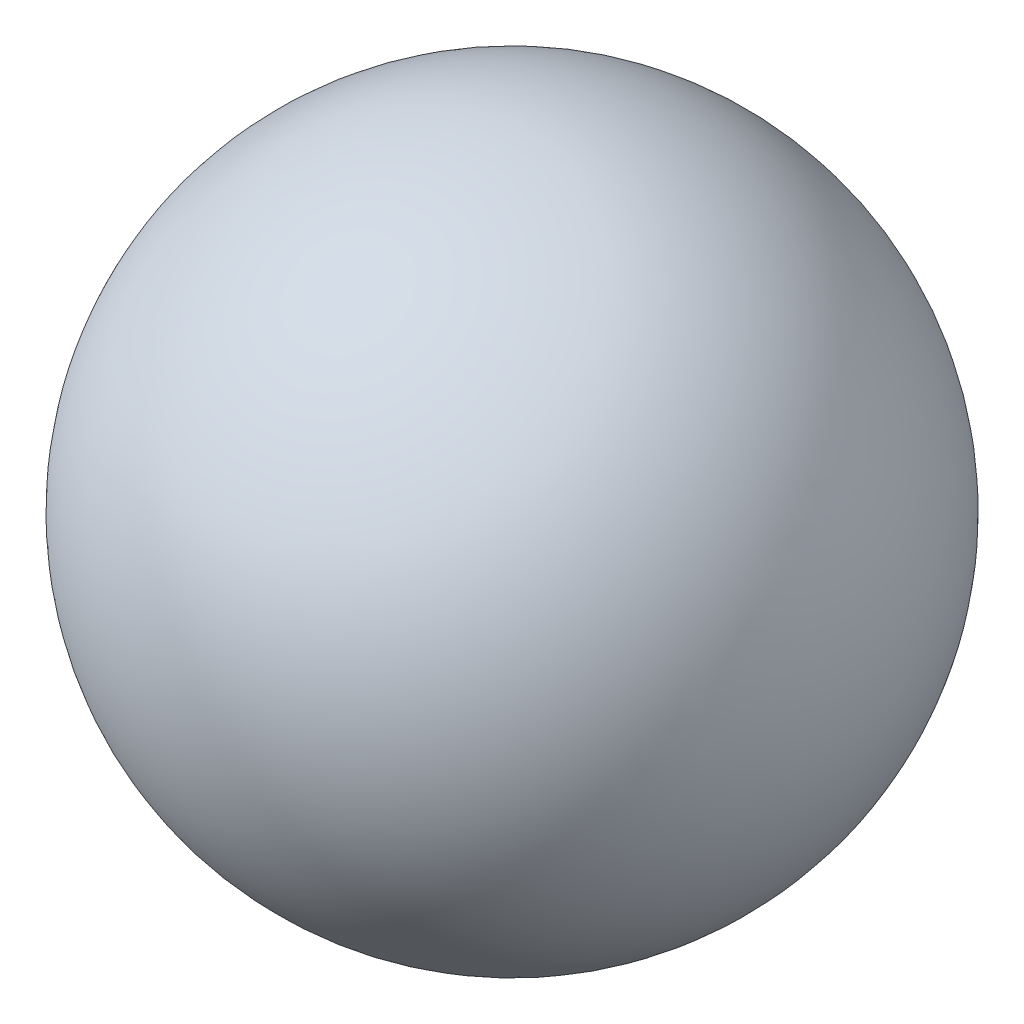
ISO-10303-21;
HEADER;
FILE_DESCRIPTION(('STEP AP214'),'2;1');
FILE_NAME('part.step','',(''),(''),'','','');
FILE_SCHEMA(('AUTOMOTIVE_DESIGN { 1 0 10303 214 1 1 1 1 }'));
ENDSEC;
DATA;
#1=APPLICATION_CONTEXT('core data for automotive mechanical design processes');
#2=APPLICATION_PROTOCOL_DEFINITION('international standard','automotive_design',2000,#1);
#3=PRODUCT_CONTEXT('',#1,'mechanical');
#4=PRODUCT('Part','Part','',(#3));
#5=PRODUCT_RELATED_PRODUCT_CATEGORY('part','',(#4));
#6=PRODUCT_DEFINITION_FORMATION('','',#4);
#7=PRODUCT_DEFINITION_CONTEXT('part definition',#1,'design');
#8=PRODUCT_DEFINITION('design','',#6,#7);
#9=PRODUCT_DEFINITION_SHAPE('','',#8);
#10=(LENGTH_UNIT() NAMED_UNIT(*) SI_UNIT(.MILLI.,.METRE.));
#11=(NAMED_UNIT(*) PLANE_ANGLE_UNIT() SI_UNIT($,.RADIAN.));
#12=(NAMED_UNIT(*) SI_UNIT($,.STERADIAN.) SOLID_ANGLE_UNIT());
#13=UNCERTAINTY_MEASURE_WITH_UNIT(LENGTH_MEASURE(1.E-05),#10,'distance_accuracy_value','');
#14=(GEOMETRIC_REPRESENTATION_CONTEXT(3) GLOBAL_UNCERTAINTY_ASSIGNED_CONTEXT((#13)) GLOBAL_UNIT_ASSIGNED_CONTEXT((#10,
#11,#12)) REPRESENTATION_CONTEXT('',''));
#15=CARTESIAN_POINT('',(0.,0.,0.));
#16=DIRECTION('',(0.,0.,1.));
#17=DIRECTION('',(1.,0.,0.));
#18=AXIS2_PLACEMENT_3D('',#15,#16,#17);
#19=CARTESIAN_POINT('',(0.,0.,0.));
#20=DIRECTION('',(-1.,0.,0.));
#21=DIRECTION('',(0.,0.,1.));
#22=AXIS2_PLACEMENT_3D('',#19,#20,#21);
#23=SPHERICAL_SURFACE('',#22,31.7372583293297);
#24=CARTESIAN_POINT('',(-31.7372583293297,0.,0.));
#25=VERTEX_POINT('',#24);
#26=VERTEX_LOOP('',#25);
#27=FACE_BOUND('',#26,.T.);
#28=ADVANCED_FACE('F35',(#27),#23,.T.);
#29=CLOSED_SHELL('',(#28));
#30=MANIFOLD_SOLID_BREP('B2',#29);
#31=ADVANCED_BREP_SHAPE_REPRESENTATION('',(#18,#30),#14);
#32=SHAPE_DEFINITION_REPRESENTATION(#9,#31);
ENDSEC;
END-ISO-10303-21;
